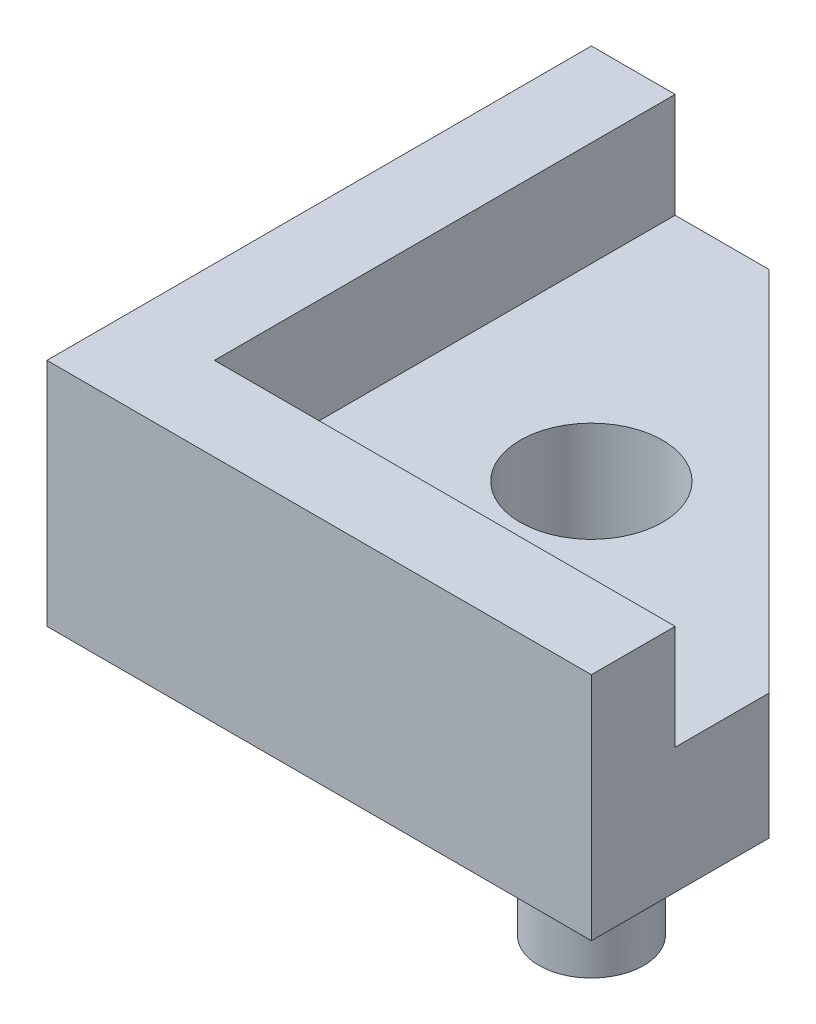
ISO-10303-21;
HEADER;
FILE_DESCRIPTION(('STEP AP214'),'2;1');
FILE_NAME('part.step','',(''),(''),'','','');
FILE_SCHEMA(('AUTOMOTIVE_DESIGN { 1 0 10303 214 1 1 1 1 }'));
ENDSEC;
DATA;
#1=APPLICATION_CONTEXT('core data for automotive mechanical design processes');
#2=APPLICATION_PROTOCOL_DEFINITION('international standard','automotive_design',2000,#1);
#3=PRODUCT_CONTEXT('',#1,'mechanical');
#4=PRODUCT('Part','Part','',(#3));
#5=PRODUCT_RELATED_PRODUCT_CATEGORY('part','',(#4));
#6=PRODUCT_DEFINITION_FORMATION('','',#4);
#7=PRODUCT_DEFINITION_CONTEXT('part definition',#1,'design');
#8=PRODUCT_DEFINITION('design','',#6,#7);
#9=PRODUCT_DEFINITION_SHAPE('','',#8);
#10=(LENGTH_UNIT() NAMED_UNIT(*) SI_UNIT(.MILLI.,.METRE.));
#11=(NAMED_UNIT(*) PLANE_ANGLE_UNIT() SI_UNIT($,.RADIAN.));
#12=(NAMED_UNIT(*) SI_UNIT($,.STERADIAN.) SOLID_ANGLE_UNIT());
#13=UNCERTAINTY_MEASURE_WITH_UNIT(LENGTH_MEASURE(1.E-05),#10,'distance_accuracy_value','');
#14=(GEOMETRIC_REPRESENTATION_CONTEXT(3) GLOBAL_UNCERTAINTY_ASSIGNED_CONTEXT((#13)) GLOBAL_UNIT_ASSIGNED_CONTEXT((#10,
#11,#12)) REPRESENTATION_CONTEXT('',''));
#15=CARTESIAN_POINT('',(0.,0.,0.));
#16=DIRECTION('',(0.,0.,1.));
#17=DIRECTION('',(1.,0.,0.));
#18=AXIS2_PLACEMENT_3D('',#15,#16,#17);
#19=CARTESIAN_POINT('',(-2.5,-3.,2.5));
#20=DIRECTION('',(0.,0.,1.));
#21=DIRECTION('',(1.,0.,0.));
#22=AXIS2_PLACEMENT_3D('',#19,#20,#21);
#23=PLANE('',#22);
#24=DIRECTION('',(0.,1.,0.));
#25=VECTOR('',#24,1.);
#26=CARTESIAN_POINT('',(10.5,-3.,2.5));
#27=LINE('',#26,#25);
#28=CARTESIAN_POINT('',(10.5,-3.,2.5));
#29=VERTEX_POINT('',#28);
#30=CARTESIAN_POINT('',(10.5,2.5,2.5));
#31=VERTEX_POINT('',#30);
#32=EDGE_CURVE('E196',#29,#31,#27,.T.);
#33=ORIENTED_EDGE('',*,*,#32,.T.);
#34=DIRECTION('',(1.,0.,0.));
#35=VECTOR('',#34,1.);
#36=CARTESIAN_POINT('',(-2.5,2.5,2.5));
#37=LINE('',#36,#35);
#38=CARTESIAN_POINT('',(-2.5,2.5,2.5));
#39=VERTEX_POINT('',#38);
#40=EDGE_CURVE('E132',#39,#31,#37,.T.);
#41=ORIENTED_EDGE('',*,*,#40,.F.);
#42=DIRECTION('',(0.,1.,0.));
#43=VECTOR('',#42,1.);
#44=CARTESIAN_POINT('',(-2.5,-3.,2.5));
#45=LINE('',#44,#43);
#46=CARTESIAN_POINT('',(-2.5,-3.,2.5));
#47=VERTEX_POINT('',#46);
#48=EDGE_CURVE('E122',#47,#39,#45,.T.);
#49=ORIENTED_EDGE('',*,*,#48,.F.);
#50=DIRECTION('',(1.,0.,0.));
#51=VECTOR('',#50,1.);
#52=CARTESIAN_POINT('',(-2.5,-3.,2.5));
#53=LINE('',#52,#51);
#54=EDGE_CURVE('E179',#47,#29,#53,.T.);
#55=ORIENTED_EDGE('',*,*,#54,.T.);
#56=EDGE_LOOP('',(#33,#41,#49,#55));
#57=FACE_BOUND('',#56,.T.);
#58=ADVANCED_FACE('F45',(#57),#23,.T.);
#59=CARTESIAN_POINT('',(-2.5,-3.,-10.5));
#60=DIRECTION('',(-1.,0.,0.));
#61=DIRECTION('',(0.,0.,1.));
#62=AXIS2_PLACEMENT_3D('',#59,#60,#61);
#63=PLANE('',#62);
#64=ORIENTED_EDGE('',*,*,#48,.T.);
#65=DIRECTION('',(0.,0.,1.));
#66=VECTOR('',#65,1.);
#67=CARTESIAN_POINT('',(-2.5,2.5,-10.5));
#68=LINE('',#67,#66);
#69=CARTESIAN_POINT('',(-2.5,2.5,-10.5));
#70=VERTEX_POINT('',#69);
#71=EDGE_CURVE('E126',#70,#39,#68,.T.);
#72=ORIENTED_EDGE('',*,*,#71,.F.);
#73=DIRECTION('',(0.,1.,0.));
#74=VECTOR('',#73,1.);
#75=CARTESIAN_POINT('',(-2.5,-3.,-10.5));
#76=LINE('',#75,#74);
#77=CARTESIAN_POINT('',(-2.5,-3.,-10.5));
#78=VERTEX_POINT('',#77);
#79=EDGE_CURVE('E110',#78,#70,#76,.T.);
#80=ORIENTED_EDGE('',*,*,#79,.F.);
#81=DIRECTION('',(0.,0.,1.));
#82=VECTOR('',#81,1.);
#83=CARTESIAN_POINT('',(-2.5,-3.,-10.5));
#84=LINE('',#83,#82);
#85=EDGE_CURVE('E193',#78,#47,#84,.T.);
#86=ORIENTED_EDGE('',*,*,#85,.T.);
#87=EDGE_LOOP('',(#64,#72,#80,#86));
#88=FACE_BOUND('',#87,.T.);
#89=ADVANCED_FACE('F127',(#88),#63,.T.);
#90=CARTESIAN_POINT('',(1.74264068711924,-3.,-10.5));
#91=DIRECTION('',(0.,0.,-1.));
#92=DIRECTION('',(-1.,0.,0.));
#93=AXIS2_PLACEMENT_3D('',#90,#91,#92);
#94=PLANE('',#93);
#95=DIRECTION('',(-1.,0.,0.));
#96=VECTOR('',#95,1.);
#97=CARTESIAN_POINT('',(1.74264068711924,0.,-10.5));
#98=LINE('',#97,#96);
#99=CARTESIAN_POINT('',(1.74264068711924,0.,-10.5));
#100=VERTEX_POINT('',#99);
#101=CARTESIAN_POINT('',(-0.5,0.,-10.5));
#102=VERTEX_POINT('',#101);
#103=EDGE_CURVE('E60',#100,#102,#98,.T.);
#104=ORIENTED_EDGE('',*,*,#103,.F.);
#105=DIRECTION('',(0.,1.,0.));
#106=VECTOR('',#105,1.);
#107=CARTESIAN_POINT('',(1.74264068711924,-3.,-10.5));
#108=LINE('',#107,#106);
#109=CARTESIAN_POINT('',(1.74264068711924,-3.,-10.5));
#110=VERTEX_POINT('',#109);
#111=EDGE_CURVE('E123',#110,#100,#108,.T.);
#112=ORIENTED_EDGE('',*,*,#111,.F.);
#113=DIRECTION('',(-1.,0.,0.));
#114=VECTOR('',#113,1.);
#115=CARTESIAN_POINT('',(1.74264068711924,-3.,-10.5));
#116=LINE('',#115,#114);
#117=EDGE_CURVE('E117',#110,#78,#116,.T.);
#118=ORIENTED_EDGE('',*,*,#117,.T.);
#119=ORIENTED_EDGE('',*,*,#79,.T.);
#120=DIRECTION('',(-1.,0.,0.));
#121=VECTOR('',#120,1.);
#122=CARTESIAN_POINT('',(-0.5,2.5,-10.5));
#123=LINE('',#122,#121);
#124=CARTESIAN_POINT('',(-0.5,2.5,-10.5));
#125=VERTEX_POINT('',#124);
#126=EDGE_CURVE('E115',#125,#70,#123,.T.);
#127=ORIENTED_EDGE('',*,*,#126,.F.);
#128=DIRECTION('',(0.,-1.,0.));
#129=VECTOR('',#128,1.);
#130=CARTESIAN_POINT('',(-0.5,2.5,-10.5));
#131=LINE('',#130,#129);
#132=EDGE_CURVE('E157',#125,#102,#131,.T.);
#133=ORIENTED_EDGE('',*,*,#132,.T.);
#134=EDGE_LOOP('',(#104,#112,#118,#119,#127,#133));
#135=FACE_BOUND('',#134,.T.);
#136=ADVANCED_FACE('F112',(#135),#94,.T.);
#137=CARTESIAN_POINT('',(10.5,-3.,-1.74264068711933));
#138=DIRECTION('',(0.707106781186544,0.,-0.707106781186551));
#139=DIRECTION('',(-0.707106781186551,0.,-0.707106781186544));
#140=AXIS2_PLACEMENT_3D('',#137,#138,#139);
#141=PLANE('',#140);
#142=DIRECTION('',(-0.707106781186551,0.,-0.707106781186544));
#143=VECTOR('',#142,1.);
#144=CARTESIAN_POINT('',(10.5,0.,-1.74264068711933));
#145=LINE('',#144,#143);
#146=CARTESIAN_POINT('',(10.5,0.,-1.74264068711933));
#147=VERTEX_POINT('',#146);
#148=EDGE_CURVE('E199',#147,#100,#145,.T.);
#149=ORIENTED_EDGE('',*,*,#148,.F.);
#150=DIRECTION('',(0.,1.,0.));
#151=VECTOR('',#150,1.);
#152=CARTESIAN_POINT('',(10.5,-3.,-1.74264068711933));
#153=LINE('',#152,#151);
#154=CARTESIAN_POINT('',(10.5,-3.,-1.74264068711933));
#155=VERTEX_POINT('',#154);
#156=EDGE_CURVE('E208',#155,#147,#153,.T.);
#157=ORIENTED_EDGE('',*,*,#156,.F.);
#158=DIRECTION('',(-0.707106781186551,0.,-0.707106781186544));
#159=VECTOR('',#158,1.);
#160=CARTESIAN_POINT('',(10.5,-3.,-1.74264068711933));
#161=LINE('',#160,#159);
#162=EDGE_CURVE('E187',#155,#110,#161,.T.);
#163=ORIENTED_EDGE('',*,*,#162,.T.);
#164=ORIENTED_EDGE('',*,*,#111,.T.);
#165=EDGE_LOOP('',(#149,#157,#163,#164));
#166=FACE_BOUND('',#165,.T.);
#167=ADVANCED_FACE('F241',(#166),#141,.T.);
#168=CARTESIAN_POINT('',(10.5,-3.,2.5));
#169=DIRECTION('',(1.,0.,0.));
#170=DIRECTION('',(0.,0.,-1.));
#171=AXIS2_PLACEMENT_3D('',#168,#169,#170);
#172=PLANE('',#171);
#173=DIRECTION('',(0.,0.,-1.));
#174=VECTOR('',#173,1.);
#175=CARTESIAN_POINT('',(10.5,0.,2.5));
#176=LINE('',#175,#174);
#177=CARTESIAN_POINT('',(10.5,0.,0.500000000000001));
#178=VERTEX_POINT('',#177);
#179=EDGE_CURVE('E178',#178,#147,#176,.T.);
#180=ORIENTED_EDGE('',*,*,#179,.F.);
#181=DIRECTION('',(0.,-1.,0.));
#182=VECTOR('',#181,1.);
#183=CARTESIAN_POINT('',(10.5,2.5,0.5));
#184=LINE('',#183,#182);
#185=CARTESIAN_POINT('',(10.5,2.5,0.5));
#186=VERTEX_POINT('',#185);
#187=EDGE_CURVE('E166',#186,#178,#184,.T.);
#188=ORIENTED_EDGE('',*,*,#187,.F.);
#189=DIRECTION('',(0.,0.,-1.));
#190=VECTOR('',#189,1.);
#191=CARTESIAN_POINT('',(10.5,2.5,2.5));
#192=LINE('',#191,#190);
#193=EDGE_CURVE('E149',#31,#186,#192,.T.);
#194=ORIENTED_EDGE('',*,*,#193,.F.);
#195=ORIENTED_EDGE('',*,*,#32,.F.);
#196=DIRECTION('',(0.,0.,-1.));
#197=VECTOR('',#196,1.);
#198=CARTESIAN_POINT('',(10.5,-3.,2.5));
#199=LINE('',#198,#197);
#200=EDGE_CURVE('E183',#29,#155,#199,.T.);
#201=ORIENTED_EDGE('',*,*,#200,.T.);
#202=ORIENTED_EDGE('',*,*,#156,.T.);
#203=EDGE_LOOP('',(#180,#188,#194,#195,#201,#202));
#204=FACE_BOUND('',#203,.T.);
#205=ADVANCED_FACE('F223',(#204),#172,.T.);
#206=CARTESIAN_POINT('',(0.,-3.,0.));
#207=DIRECTION('',(0.,1.,0.));
#208=DIRECTION('',(0.,0.,1.));
#209=AXIS2_PLACEMENT_3D('',#206,#207,#208);
#210=PLANE('',#209);
#211=CARTESIAN_POINT('',(4.,-3.,-4.));
#212=DIRECTION('',(0.,1.,0.));
#213=DIRECTION('',(0.,0.,1.));
#214=AXIS2_PLACEMENT_3D('',#211,#212,#213);
#215=CIRCLE('',#214,1.7);
#216=CARTESIAN_POINT('',(4.,-3.,-2.3));
#217=VERTEX_POINT('',#216);
#218=EDGE_CURVE('E144',#217,#217,#215,.F.);
#219=ORIENTED_EDGE('',*,*,#218,.F.);
#220=EDGE_LOOP('',(#219));
#221=FACE_BOUND('',#220,.T.);
#222=CARTESIAN_POINT('',(0.11091270347399,-3.,-7.88908729652601));
#223=DIRECTION('',(0.,1.,0.));
#224=DIRECTION('',(0.,0.,1.));
#225=AXIS2_PLACEMENT_3D('',#222,#223,#224);
#226=CIRCLE('',#225,1.25);
#227=CARTESIAN_POINT('',(0.11091270347399,-3.,-6.63908729652601));
#228=VERTEX_POINT('',#227);
#229=EDGE_CURVE('E11',#228,#228,#226,.F.);
#230=ORIENTED_EDGE('',*,*,#229,.F.);
#231=EDGE_LOOP('',(#230));
#232=FACE_BOUND('',#231,.T.);
#233=CARTESIAN_POINT('',(7.88908729652601,-3.,-0.110912703473988));
#234=DIRECTION('',(0.,1.,0.));
#235=DIRECTION('',(0.,0.,1.));
#236=AXIS2_PLACEMENT_3D('',#233,#234,#235);
#237=CIRCLE('',#236,1.25);
#238=CARTESIAN_POINT('',(7.88908729652601,-3.,1.13908729652601));
#239=VERTEX_POINT('',#238);
#240=EDGE_CURVE('E53',#239,#239,#237,.F.);
#241=ORIENTED_EDGE('',*,*,#240,.F.);
#242=EDGE_LOOP('',(#241));
#243=FACE_BOUND('',#242,.T.);
#244=ORIENTED_EDGE('',*,*,#54,.F.);
#245=ORIENTED_EDGE('',*,*,#85,.F.);
#246=ORIENTED_EDGE('',*,*,#117,.F.);
#247=ORIENTED_EDGE('',*,*,#162,.F.);
#248=ORIENTED_EDGE('',*,*,#200,.F.);
#249=EDGE_LOOP('',(#244,#245,#246,#247,#248));
#250=FACE_BOUND('',#249,.T.);
#251=ADVANCED_FACE('F219',(#221,#232,#243,#250),#210,.F.);
#252=CARTESIAN_POINT('',(0.,0.,0.));
#253=DIRECTION('',(0.,1.,0.));
#254=DIRECTION('',(0.,0.,1.));
#255=AXIS2_PLACEMENT_3D('',#252,#253,#254);
#256=PLANE('',#255);
#257=CARTESIAN_POINT('',(4.,0.,-4.));
#258=DIRECTION('',(0.,1.,0.));
#259=DIRECTION('',(0.,0.,1.));
#260=AXIS2_PLACEMENT_3D('',#257,#258,#259);
#261=CIRCLE('',#260,1.7);
#262=CARTESIAN_POINT('',(4.,0.,-2.3));
#263=VERTEX_POINT('',#262);
#264=EDGE_CURVE('E289',#263,#263,#261,.T.);
#265=ORIENTED_EDGE('',*,*,#264,.F.);
#266=EDGE_LOOP('',(#265));
#267=FACE_BOUND('',#266,.T.);
#268=DIRECTION('',(0.,0.,-1.));
#269=VECTOR('',#268,1.);
#270=CARTESIAN_POINT('',(-0.5,0.,0.500000000000001));
#271=LINE('',#270,#269);
#272=CARTESIAN_POINT('',(-0.5,0.,0.500000000000001));
#273=VERTEX_POINT('',#272);
#274=EDGE_CURVE('E139',#273,#102,#271,.T.);
#275=ORIENTED_EDGE('',*,*,#274,.F.);
#276=DIRECTION('',(-1.,0.,0.));
#277=VECTOR('',#276,1.);
#278=CARTESIAN_POINT('',(10.5,0.,0.5));
#279=LINE('',#278,#277);
#280=EDGE_CURVE('E66',#178,#273,#279,.T.);
#281=ORIENTED_EDGE('',*,*,#280,.F.);
#282=ORIENTED_EDGE('',*,*,#179,.T.);
#283=ORIENTED_EDGE('',*,*,#148,.T.);
#284=ORIENTED_EDGE('',*,*,#103,.T.);
#285=EDGE_LOOP('',(#275,#281,#282,#283,#284));
#286=FACE_BOUND('',#285,.T.);
#287=ADVANCED_FACE('F222',(#267,#286),#256,.T.);
#288=CARTESIAN_POINT('',(7.88908729652601,-5.5,-0.110912703473988));
#289=DIRECTION('',(0.,1.,0.));
#290=DIRECTION('',(0.,0.,1.));
#291=AXIS2_PLACEMENT_3D('',#288,#289,#290);
#292=CYLINDRICAL_SURFACE('',#291,1.25);
#293=CARTESIAN_POINT('',(7.88908729652601,-5.5,-0.110912703473988));
#294=DIRECTION('',(0.,-1.,0.));
#295=DIRECTION('',(0.,0.,-1.));
#296=AXIS2_PLACEMENT_3D('',#293,#294,#295);
#297=CIRCLE('',#296,1.25);
#298=CARTESIAN_POINT('',(7.88908729652601,-5.5,-1.36091270347399));
#299=VERTEX_POINT('',#298);
#300=EDGE_CURVE('E174',#299,#299,#297,.T.);
#301=ORIENTED_EDGE('',*,*,#300,.F.);
#302=EDGE_LOOP('',(#301));
#303=FACE_BOUND('',#302,.T.);
#304=ORIENTED_EDGE('',*,*,#240,.T.);
#305=EDGE_LOOP('',(#304));
#306=FACE_BOUND('',#305,.T.);
#307=ADVANCED_FACE('F217',(#303,#306),#292,.T.);
#308=CARTESIAN_POINT('',(7.88908729652601,-5.5,-0.110912703473988));
#309=DIRECTION('',(0.,-1.,0.));
#310=DIRECTION('',(0.,0.,-1.));
#311=AXIS2_PLACEMENT_3D('',#308,#309,#310);
#312=PLANE('',#311);
#313=ORIENTED_EDGE('',*,*,#300,.T.);
#314=EDGE_LOOP('',(#313));
#315=FACE_BOUND('',#314,.T.);
#316=ADVANCED_FACE('F263',(#315),#312,.T.);
#317=CARTESIAN_POINT('',(0.11091270347399,-5.5,-7.88908729652601));
#318=DIRECTION('',(0.,1.,0.));
#319=DIRECTION('',(0.,0.,1.));
#320=AXIS2_PLACEMENT_3D('',#317,#318,#319);
#321=CYLINDRICAL_SURFACE('',#320,1.25);
#322=CARTESIAN_POINT('',(0.11091270347399,-5.5,-7.88908729652601));
#323=DIRECTION('',(0.,-1.,0.));
#324=DIRECTION('',(0.,0.,-1.));
#325=AXIS2_PLACEMENT_3D('',#322,#323,#324);
#326=CIRCLE('',#325,1.25);
#327=CARTESIAN_POINT('',(0.11091270347399,-5.5,-9.13908729652601));
#328=VERTEX_POINT('',#327);
#329=EDGE_CURVE('E170',#328,#328,#326,.T.);
#330=ORIENTED_EDGE('',*,*,#329,.F.);
#331=EDGE_LOOP('',(#330));
#332=FACE_BOUND('',#331,.T.);
#333=ORIENTED_EDGE('',*,*,#229,.T.);
#334=EDGE_LOOP('',(#333));
#335=FACE_BOUND('',#334,.T.);
#336=ADVANCED_FACE('F267',(#332,#335),#321,.T.);
#337=CARTESIAN_POINT('',(0.11091270347399,-5.5,-7.88908729652601));
#338=DIRECTION('',(0.,-1.,0.));
#339=DIRECTION('',(0.,0.,-1.));
#340=AXIS2_PLACEMENT_3D('',#337,#338,#339);
#341=PLANE('',#340);
#342=ORIENTED_EDGE('',*,*,#329,.T.);
#343=EDGE_LOOP('',(#342));
#344=FACE_BOUND('',#343,.T.);
#345=ADVANCED_FACE('F269',(#344),#341,.T.);
#346=CARTESIAN_POINT('',(10.5,2.5,0.5));
#347=DIRECTION('',(0.,0.,1.));
#348=DIRECTION('',(1.,0.,0.));
#349=AXIS2_PLACEMENT_3D('',#346,#347,#348);
#350=PLANE('',#349);
#351=ORIENTED_EDGE('',*,*,#280,.T.);
#352=DIRECTION('',(0.,-1.,0.));
#353=VECTOR('',#352,1.);
#354=CARTESIAN_POINT('',(-0.5,2.5,0.500000000000001));
#355=LINE('',#354,#353);
#356=CARTESIAN_POINT('',(-0.5,2.5,0.500000000000001));
#357=VERTEX_POINT('',#356);
#358=EDGE_CURVE('E162',#357,#273,#355,.T.);
#359=ORIENTED_EDGE('',*,*,#358,.F.);
#360=DIRECTION('',(-1.,0.,0.));
#361=VECTOR('',#360,1.);
#362=CARTESIAN_POINT('',(10.5,2.5,0.5));
#363=LINE('',#362,#361);
#364=EDGE_CURVE('E152',#186,#357,#363,.T.);
#365=ORIENTED_EDGE('',*,*,#364,.F.);
#366=ORIENTED_EDGE('',*,*,#187,.T.);
#367=EDGE_LOOP('',(#351,#359,#365,#366));
#368=FACE_BOUND('',#367,.T.);
#369=ADVANCED_FACE('F236',(#368),#350,.F.);
#370=CARTESIAN_POINT('',(-0.5,2.5,0.500000000000001));
#371=DIRECTION('',(-1.,0.,0.));
#372=DIRECTION('',(0.,0.,1.));
#373=AXIS2_PLACEMENT_3D('',#370,#371,#372);
#374=PLANE('',#373);
#375=ORIENTED_EDGE('',*,*,#274,.T.);
#376=ORIENTED_EDGE('',*,*,#132,.F.);
#377=DIRECTION('',(0.,0.,-1.));
#378=VECTOR('',#377,1.);
#379=CARTESIAN_POINT('',(-0.5,2.5,0.500000000000001));
#380=LINE('',#379,#378);
#381=EDGE_CURVE('E136',#357,#125,#380,.T.);
#382=ORIENTED_EDGE('',*,*,#381,.F.);
#383=ORIENTED_EDGE('',*,*,#358,.T.);
#384=EDGE_LOOP('',(#375,#376,#382,#383));
#385=FACE_BOUND('',#384,.T.);
#386=ADVANCED_FACE('F238',(#385),#374,.F.);
#387=CARTESIAN_POINT('',(0.,2.5,0.));
#388=DIRECTION('',(0.,1.,0.));
#389=DIRECTION('',(0.,0.,1.));
#390=AXIS2_PLACEMENT_3D('',#387,#388,#389);
#391=PLANE('',#390);
#392=ORIENTED_EDGE('',*,*,#126,.T.);
#393=ORIENTED_EDGE('',*,*,#71,.T.);
#394=ORIENTED_EDGE('',*,*,#40,.T.);
#395=ORIENTED_EDGE('',*,*,#193,.T.);
#396=ORIENTED_EDGE('',*,*,#364,.T.);
#397=ORIENTED_EDGE('',*,*,#381,.T.);
#398=EDGE_LOOP('',(#392,#393,#394,#395,#396,#397));
#399=FACE_BOUND('',#398,.T.);
#400=ADVANCED_FACE('F134',(#399),#391,.T.);
#401=CARTESIAN_POINT('',(4.,-5.501,-4.));
#402=DIRECTION('',(0.,1.,0.));
#403=DIRECTION('',(0.,0.,1.));
#404=AXIS2_PLACEMENT_3D('',#401,#402,#403);
#405=CYLINDRICAL_SURFACE('',#404,1.7);
#406=CARTESIAN_POINT('',(4.,0.,-2.3));
#407=CARTESIAN_POINT('',(4.,-0.03125,-2.3));
#408=CARTESIAN_POINT('',(4.,-0.0625000000000001,-2.3));
#409=CARTESIAN_POINT('',(4.,-0.125,-2.3));
#410=CARTESIAN_POINT('',(4.,-0.15625,-2.3));
#411=CARTESIAN_POINT('',(4.,-0.21875,-2.3));
#412=CARTESIAN_POINT('',(4.,-0.25,-2.3));
#413=CARTESIAN_POINT('',(4.,-0.3125,-2.3));
#414=CARTESIAN_POINT('',(4.,-0.34375,-2.3));
#415=CARTESIAN_POINT('',(4.,-0.40625,-2.3));
#416=CARTESIAN_POINT('',(4.,-0.4375,-2.3));
#417=CARTESIAN_POINT('',(4.,-0.5,-2.3));
#418=CARTESIAN_POINT('',(4.,-0.53125,-2.3));
#419=CARTESIAN_POINT('',(4.,-0.593750000000001,-2.3));
#420=CARTESIAN_POINT('',(4.,-0.625000000000001,-2.3));
#421=CARTESIAN_POINT('',(4.,-0.687500000000001,-2.3));
#422=CARTESIAN_POINT('',(4.,-0.718750000000001,-2.3));
#423=CARTESIAN_POINT('',(4.,-0.781250000000001,-2.3));
#424=CARTESIAN_POINT('',(4.,-0.812500000000001,-2.3));
#425=CARTESIAN_POINT('',(4.,-0.875,-2.3));
#426=CARTESIAN_POINT('',(4.,-0.90625,-2.3));
#427=CARTESIAN_POINT('',(4.,-0.96875,-2.3));
#428=CARTESIAN_POINT('',(4.,-1.,-2.3));
#429=CARTESIAN_POINT('',(4.,-1.0625,-2.3));
#430=CARTESIAN_POINT('',(4.,-1.09375,-2.3));
#431=CARTESIAN_POINT('',(4.,-1.15625,-2.3));
#432=CARTESIAN_POINT('',(4.,-1.1875,-2.3));
#433=CARTESIAN_POINT('',(4.,-1.25,-2.3));
#434=CARTESIAN_POINT('',(4.,-1.28125,-2.3));
#435=CARTESIAN_POINT('',(4.,-1.34375,-2.3));
#436=CARTESIAN_POINT('',(4.,-1.375,-2.3));
#437=CARTESIAN_POINT('',(4.,-1.4375,-2.3));
#438=CARTESIAN_POINT('',(4.,-1.46875,-2.3));
#439=CARTESIAN_POINT('',(4.,-1.53125,-2.3));
#440=CARTESIAN_POINT('',(4.,-1.5625,-2.3));
#441=CARTESIAN_POINT('',(4.,-1.625,-2.3));
#442=CARTESIAN_POINT('',(4.,-1.65625,-2.3));
#443=CARTESIAN_POINT('',(4.,-1.71875,-2.3));
#444=CARTESIAN_POINT('',(4.,-1.75,-2.3));
#445=CARTESIAN_POINT('',(4.,-1.8125,-2.3));
#446=CARTESIAN_POINT('',(4.,-1.84375,-2.3));
#447=CARTESIAN_POINT('',(4.,-1.90625,-2.3));
#448=CARTESIAN_POINT('',(4.,-1.9375,-2.3));
#449=CARTESIAN_POINT('',(4.,-2.,-2.3));
#450=CARTESIAN_POINT('',(4.,-2.03125,-2.3));
#451=CARTESIAN_POINT('',(4.,-2.09375,-2.3));
#452=CARTESIAN_POINT('',(4.,-2.125,-2.3));
#453=CARTESIAN_POINT('',(4.,-2.1875,-2.3));
#454=CARTESIAN_POINT('',(4.,-2.21875,-2.3));
#455=CARTESIAN_POINT('',(4.,-2.28125,-2.3));
#456=CARTESIAN_POINT('',(4.,-2.3125,-2.3));
#457=CARTESIAN_POINT('',(4.,-2.375,-2.3));
#458=CARTESIAN_POINT('',(4.,-2.40625,-2.3));
#459=CARTESIAN_POINT('',(4.,-2.46875,-2.3));
#460=CARTESIAN_POINT('',(4.,-2.5,-2.3));
#461=CARTESIAN_POINT('',(4.,-2.5625,-2.3));
#462=CARTESIAN_POINT('',(4.,-2.59375,-2.3));
#463=CARTESIAN_POINT('',(4.,-2.65625,-2.3));
#464=CARTESIAN_POINT('',(4.,-2.6875,-2.3));
#465=CARTESIAN_POINT('',(4.,-2.75,-2.3));
#466=CARTESIAN_POINT('',(4.,-2.78125,-2.3));
#467=CARTESIAN_POINT('',(4.,-2.84375,-2.3));
#468=CARTESIAN_POINT('',(4.,-2.875,-2.3));
#469=CARTESIAN_POINT('',(4.,-2.9375,-2.3));
#470=CARTESIAN_POINT('',(4.,-2.96875,-2.3));
#471=CARTESIAN_POINT('',(4.,-3.,-2.3));
#472=B_SPLINE_CURVE_WITH_KNOTS('',3,(#406,#407,#408,#409,#410,#411,#412,#413,#414,#415,#416,
#417,#418,#419,#420,#421,#422,#423,#424,#425,#426,#427,#428,#429,#430,#431,#432,#433,#434,#435,
#436,#437,#438,#439,#440,#441,#442,#443,#444,#445,#446,#447,#448,#449,#450,#451,#452,#453,#454,
#455,#456,#457,#458,#459,#460,#461,#462,#463,#464,#465,#466,#467,#468,#469,#470,#471),
.UNSPECIFIED.,.F.,.F.,(4,2,2,2,2,2,2,2,2,2,2,2,2,2,2,2,2,2,2,2,2,2,2,2,2,2,2,2,2,2,2,2,4),(0.,
0.0937500000000001,0.1875,0.28125,0.375,0.46875,0.5625,0.656250000000001,0.750000000000001,
0.843750000000001,0.9375,1.03125,1.125,1.21875,1.3125,1.40625,1.5,1.59375,1.6875,1.78125,1.875,
1.96875,2.0625,2.15625,2.25,2.34375,2.4375,2.53125,2.625,2.71875,2.8125,2.90625,3.),.UNSPECIFIED.);
#473=EDGE_CURVE('BSEAM281',#263,#217,#472,.T.);
#474=ORIENTED_EDGE('',*,*,#264,.T.);
#475=ORIENTED_EDGE('',*,*,#218,.T.);
#476=ORIENTED_EDGE('',*,*,#473,.T.);
#477=ORIENTED_EDGE('',*,*,#473,.F.);
#478=EDGE_LOOP('',(#474,#476,#475,#477));
#479=FACE_BOUND('',#478,.T.);
#480=ADVANCED_FACE('F281',(#479),#405,.F.);
#481=CLOSED_SHELL('',(#58,#89,#136,#167,#205,#251,#287,#307,#316,#336,#345,#369,#386,#400,#480));
#482=MANIFOLD_SOLID_BREP('B2',#481);
#483=ADVANCED_BREP_SHAPE_REPRESENTATION('',(#18,#482),#14);
#484=SHAPE_DEFINITION_REPRESENTATION(#9,#483);
ENDSEC;
END-ISO-10303-21;
